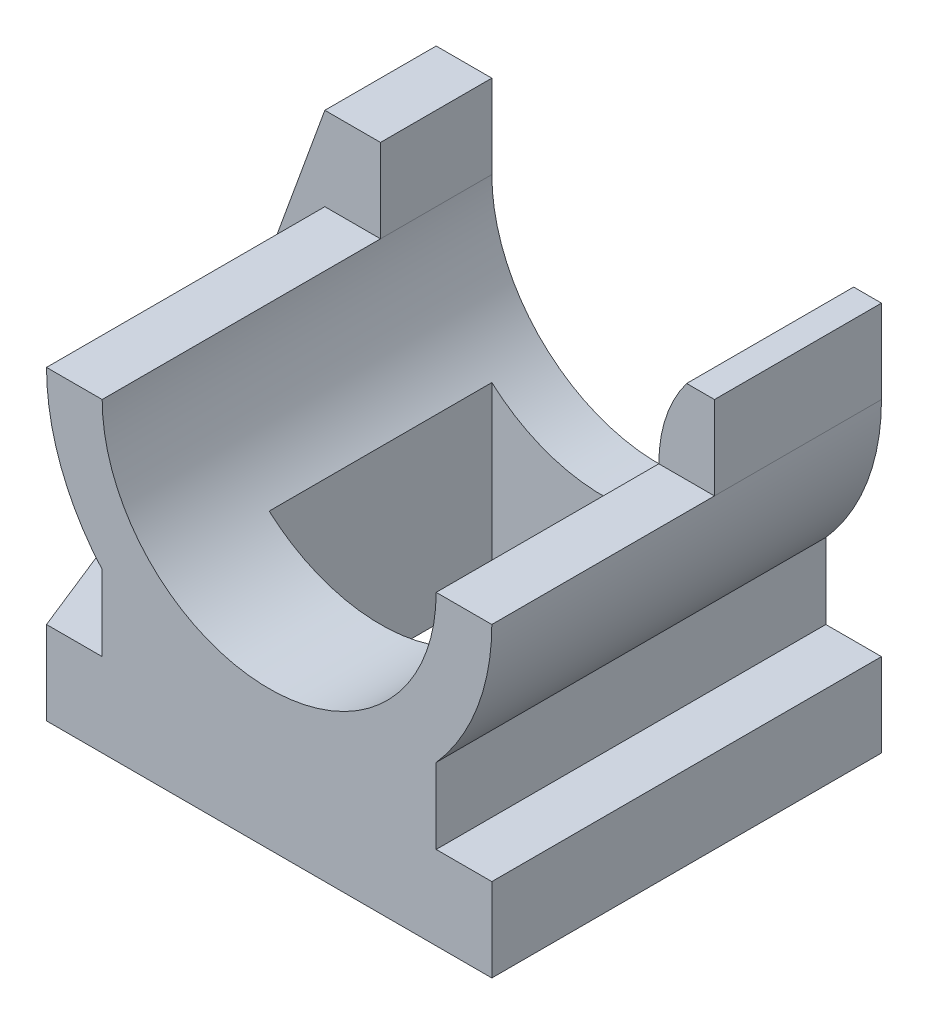
ISO-10303-21;
HEADER;
FILE_DESCRIPTION(('STEP AP214'),'2;1');
FILE_NAME('part.step','',(''),(''),'','','');
FILE_SCHEMA(('AUTOMOTIVE_DESIGN { 1 0 10303 214 1 1 1 1 }'));
ENDSEC;
DATA;
#1=APPLICATION_CONTEXT('core data for automotive mechanical design processes');
#2=APPLICATION_PROTOCOL_DEFINITION('international standard','automotive_design',2000,#1);
#3=PRODUCT_CONTEXT('',#1,'mechanical');
#4=PRODUCT('Part','Part','',(#3));
#5=PRODUCT_RELATED_PRODUCT_CATEGORY('part','',(#4));
#6=PRODUCT_DEFINITION_FORMATION('','',#4);
#7=PRODUCT_DEFINITION_CONTEXT('part definition',#1,'design');
#8=PRODUCT_DEFINITION('design','',#6,#7);
#9=PRODUCT_DEFINITION_SHAPE('','',#8);
#10=(LENGTH_UNIT() NAMED_UNIT(*) SI_UNIT(.MILLI.,.METRE.));
#11=(NAMED_UNIT(*) PLANE_ANGLE_UNIT() SI_UNIT($,.RADIAN.));
#12=(NAMED_UNIT(*) SI_UNIT($,.STERADIAN.) SOLID_ANGLE_UNIT());
#13=UNCERTAINTY_MEASURE_WITH_UNIT(LENGTH_MEASURE(1.E-05),#10,'distance_accuracy_value','');
#14=(GEOMETRIC_REPRESENTATION_CONTEXT(3) GLOBAL_UNCERTAINTY_ASSIGNED_CONTEXT((#13)) GLOBAL_UNIT_ASSIGNED_CONTEXT((#10,
#11,#12)) REPRESENTATION_CONTEXT('',''));
#15=CARTESIAN_POINT('',(0.,0.,0.));
#16=DIRECTION('',(0.,0.,1.));
#17=DIRECTION('',(1.,0.,0.));
#18=AXIS2_PLACEMENT_3D('',#15,#16,#17);
#19=CARTESIAN_POINT('',(0.,0.,0.));
#20=DIRECTION('',(0.,-1.,0.));
#21=DIRECTION('',(0.,0.,-1.));
#22=AXIS2_PLACEMENT_3D('',#19,#20,#21);
#23=PLANE('',#22);
#24=DIRECTION('',(0.,0.,1.));
#25=VECTOR('',#24,1.);
#26=CARTESIAN_POINT('',(-60.,0.,20.));
#27=LINE('',#26,#25);
#28=CARTESIAN_POINT('',(-60.,0.,0.));
#29=VERTEX_POINT('',#28);
#30=CARTESIAN_POINT('',(-60.,0.,20.));
#31=VERTEX_POINT('',#30);
#32=EDGE_CURVE('E309',#29,#31,#27,.T.);
#33=ORIENTED_EDGE('',*,*,#32,.F.);
#34=DIRECTION('',(-1.,0.,0.));
#35=VECTOR('',#34,1.);
#36=CARTESIAN_POINT('',(-60.,0.,0.));
#37=LINE('',#36,#35);
#38=CARTESIAN_POINT('',(40.,0.,0.));
#39=VERTEX_POINT('',#38);
#40=EDGE_CURVE('E312',#39,#29,#37,.T.);
#41=ORIENTED_EDGE('',*,*,#40,.F.);
#42=DIRECTION('',(0.,0.,-1.));
#43=VECTOR('',#42,1.);
#44=CARTESIAN_POINT('',(40.,0.,0.));
#45=LINE('',#44,#43);
#46=CARTESIAN_POINT('',(40.,0.,70.));
#47=VERTEX_POINT('',#46);
#48=EDGE_CURVE('E335',#47,#39,#45,.T.);
#49=ORIENTED_EDGE('',*,*,#48,.F.);
#50=DIRECTION('',(1.,0.,0.));
#51=VECTOR('',#50,1.);
#52=CARTESIAN_POINT('',(40.,0.,70.));
#53=LINE('',#52,#51);
#54=CARTESIAN_POINT('',(-40.,0.,70.));
#55=VERTEX_POINT('',#54);
#56=EDGE_CURVE('E329',#55,#47,#53,.T.);
#57=ORIENTED_EDGE('',*,*,#56,.F.);
#58=DIRECTION('',(0.371390676354104,0.,0.928476690885259));
#59=VECTOR('',#58,1.);
#60=CARTESIAN_POINT('',(-40.,0.,70.));
#61=LINE('',#60,#59);
#62=EDGE_CURVE('E327',#31,#55,#61,.T.);
#63=ORIENTED_EDGE('',*,*,#62,.F.);
#64=EDGE_LOOP('',(#33,#41,#49,#57,#63));
#65=FACE_BOUND('',#64,.T.);
#66=DIRECTION('',(-1.,0.,0.));
#67=VECTOR('',#66,1.);
#68=CARTESIAN_POINT('',(-20.,0.,10.));
#69=LINE('',#68,#67);
#70=CARTESIAN_POINT('',(20.,0.,10.));
#71=VERTEX_POINT('',#70);
#72=CARTESIAN_POINT('',(-20.,0.,10.));
#73=VERTEX_POINT('',#72);
#74=EDGE_CURVE('E215',#71,#73,#69,.T.);
#75=ORIENTED_EDGE('',*,*,#74,.T.);
#76=DIRECTION('',(0.,0.,1.));
#77=VECTOR('',#76,1.);
#78=CARTESIAN_POINT('',(-20.,0.,10.));
#79=LINE('',#78,#77);
#80=CARTESIAN_POINT('',(-20.,0.,50.));
#81=VERTEX_POINT('',#80);
#82=EDGE_CURVE('E59',#73,#81,#79,.T.);
#83=ORIENTED_EDGE('',*,*,#82,.T.);
#84=DIRECTION('',(1.,0.,0.));
#85=VECTOR('',#84,1.);
#86=CARTESIAN_POINT('',(-20.,0.,50.));
#87=LINE('',#86,#85);
#88=CARTESIAN_POINT('',(20.,0.,50.));
#89=VERTEX_POINT('',#88);
#90=EDGE_CURVE('E201',#81,#89,#87,.T.);
#91=ORIENTED_EDGE('',*,*,#90,.T.);
#92=DIRECTION('',(0.,0.,-1.));
#93=VECTOR('',#92,1.);
#94=CARTESIAN_POINT('',(20.,0.,10.));
#95=LINE('',#94,#93);
#96=EDGE_CURVE('E207',#89,#71,#95,.T.);
#97=ORIENTED_EDGE('',*,*,#96,.T.);
#98=EDGE_LOOP('',(#75,#83,#91,#97));
#99=FACE_BOUND('',#98,.T.);
#100=ADVANCED_FACE('F43',(#65,#99),#23,.T.);
#101=CARTESIAN_POINT('',(0.,55.,70.));
#102=DIRECTION('',(0.,0.,-1.));
#103=DIRECTION('',(-1.,0.,0.));
#104=AXIS2_PLACEMENT_3D('',#101,#102,#103);
#105=CYLINDRICAL_SURFACE('',#104,30.);
#106=CARTESIAN_POINT('',(0.,55.,0.));
#107=DIRECTION('',(0.,0.,1.));
#108=DIRECTION('',(1.,0.,0.));
#109=AXIS2_PLACEMENT_3D('',#106,#107,#108);
#110=CIRCLE('',#109,30.);
#111=CARTESIAN_POINT('',(-30.,55.,0.));
#112=VERTEX_POINT('',#111);
#113=CARTESIAN_POINT('',(30.,55.,0.));
#114=VERTEX_POINT('',#113);
#115=EDGE_CURVE('E200',#112,#114,#110,.T.);
#116=ORIENTED_EDGE('',*,*,#115,.F.);
#117=DIRECTION('',(0.,0.,-1.));
#118=VECTOR('',#117,1.);
#119=CARTESIAN_POINT('',(-30.,55.,70.));
#120=LINE('',#119,#118);
#121=CARTESIAN_POINT('',(-30.,55.,20.));
#122=VERTEX_POINT('',#121);
#123=EDGE_CURVE('E359',#122,#112,#120,.T.);
#124=ORIENTED_EDGE('',*,*,#123,.F.);
#125=DIRECTION('',(0.,0.,-1.));
#126=VECTOR('',#125,1.);
#127=CARTESIAN_POINT('',(-30.,55.,70.));
#128=LINE('',#127,#126);
#129=CARTESIAN_POINT('',(-30.,55.,70.));
#130=VERTEX_POINT('',#129);
#131=EDGE_CURVE('E224',#130,#122,#128,.T.);
#132=ORIENTED_EDGE('',*,*,#131,.F.);
#133=CARTESIAN_POINT('',(0.,55.,70.));
#134=DIRECTION('',(0.,0.,1.));
#135=DIRECTION('',(1.,0.,0.));
#136=AXIS2_PLACEMENT_3D('',#133,#134,#135);
#137=CIRCLE('',#136,30.);
#138=CARTESIAN_POINT('',(30.,55.,70.));
#139=VERTEX_POINT('',#138);
#140=EDGE_CURVE('E222',#130,#139,#137,.T.);
#141=ORIENTED_EDGE('',*,*,#140,.T.);
#142=DIRECTION('',(0.,0.,-1.));
#143=VECTOR('',#142,1.);
#144=CARTESIAN_POINT('',(30.,55.,70.));
#145=LINE('',#144,#143);
#146=CARTESIAN_POINT('',(30.,55.,30.));
#147=VERTEX_POINT('',#146);
#148=EDGE_CURVE('E227',#139,#147,#145,.T.);
#149=ORIENTED_EDGE('',*,*,#148,.T.);
#150=DIRECTION('',(0.,0.,-1.));
#151=VECTOR('',#150,1.);
#152=CARTESIAN_POINT('',(30.,55.,30.));
#153=LINE('',#152,#151);
#154=EDGE_CURVE('E255',#147,#114,#153,.T.);
#155=ORIENTED_EDGE('',*,*,#154,.T.);
#156=EDGE_LOOP('',(#116,#124,#132,#141,#149,#155));
#157=FACE_BOUND('',#156,.T.);
#158=CARTESIAN_POINT('',(0.,55.,50.));
#159=DIRECTION('',(0.,0.,-1.));
#160=DIRECTION('',(-1.,0.,0.));
#161=AXIS2_PLACEMENT_3D('',#158,#159,#160);
#162=CIRCLE('',#161,30.);
#163=CARTESIAN_POINT('',(20.,32.6393202250021,50.));
#164=VERTEX_POINT('',#163);
#165=CARTESIAN_POINT('',(-20.,32.6393202250021,50.));
#166=VERTEX_POINT('',#165);
#167=EDGE_CURVE('E51',#164,#166,#162,.T.);
#168=ORIENTED_EDGE('',*,*,#167,.T.);
#169=DIRECTION('',(0.,0.,-1.));
#170=VECTOR('',#169,1.);
#171=CARTESIAN_POINT('',(-20.,32.6393202250021,70.));
#172=LINE('',#171,#170);
#173=CARTESIAN_POINT('',(-20.,32.6393202250021,10.));
#174=VERTEX_POINT('',#173);
#175=EDGE_CURVE('E11',#166,#174,#172,.T.);
#176=ORIENTED_EDGE('',*,*,#175,.T.);
#177=CARTESIAN_POINT('',(0.,55.,10.));
#178=DIRECTION('',(0.,0.,1.));
#179=DIRECTION('',(1.,0.,0.));
#180=AXIS2_PLACEMENT_3D('',#177,#178,#179);
#181=CIRCLE('',#180,30.);
#182=CARTESIAN_POINT('',(20.,32.6393202250021,10.));
#183=VERTEX_POINT('',#182);
#184=EDGE_CURVE('E358',#174,#183,#181,.T.);
#185=ORIENTED_EDGE('',*,*,#184,.T.);
#186=DIRECTION('',(0.,0.,-1.));
#187=VECTOR('',#186,1.);
#188=CARTESIAN_POINT('',(20.,32.6393202250021,70.));
#189=LINE('',#188,#187);
#190=EDGE_CURVE('E361',#183,#164,#189,.F.);
#191=ORIENTED_EDGE('',*,*,#190,.T.);
#192=EDGE_LOOP('',(#168,#176,#185,#191));
#193=FACE_BOUND('',#192,.T.);
#194=ADVANCED_FACE('F368',(#157,#193),#105,.F.);
#195=CARTESIAN_POINT('',(40.,55.,70.));
#196=DIRECTION('',(0.,-1.,0.));
#197=DIRECTION('',(0.,0.,-1.));
#198=AXIS2_PLACEMENT_3D('',#195,#196,#197);
#199=PLANE('',#198);
#200=ORIENTED_EDGE('',*,*,#148,.F.);
#201=DIRECTION('',(-1.,0.,0.));
#202=VECTOR('',#201,1.);
#203=CARTESIAN_POINT('',(40.,55.,70.));
#204=LINE('',#203,#202);
#205=CARTESIAN_POINT('',(40.,55.,70.));
#206=VERTEX_POINT('',#205);
#207=EDGE_CURVE('E288',#206,#139,#204,.T.);
#208=ORIENTED_EDGE('',*,*,#207,.F.);
#209=DIRECTION('',(0.,0.,-1.));
#210=VECTOR('',#209,1.);
#211=CARTESIAN_POINT('',(40.,55.,70.));
#212=LINE('',#211,#210);
#213=CARTESIAN_POINT('',(40.,55.,30.));
#214=VERTEX_POINT('',#213);
#215=EDGE_CURVE('E301',#206,#214,#212,.T.);
#216=ORIENTED_EDGE('',*,*,#215,.T.);
#217=DIRECTION('',(1.,0.,0.));
#218=VECTOR('',#217,1.);
#219=CARTESIAN_POINT('',(30.,55.,30.));
#220=LINE('',#219,#218);
#221=EDGE_CURVE('E231',#147,#214,#220,.T.);
#222=ORIENTED_EDGE('',*,*,#221,.F.);
#223=EDGE_LOOP('',(#200,#208,#216,#222));
#224=FACE_BOUND('',#223,.T.);
#225=ADVANCED_FACE('F382',(#224),#199,.F.);
#226=CARTESIAN_POINT('',(-60.,15.,0.));
#227=DIRECTION('',(0.,0.,1.));
#228=DIRECTION('',(1.,0.,0.));
#229=AXIS2_PLACEMENT_3D('',#226,#227,#228);
#230=PLANE('',#229);
#231=DIRECTION('',(0.,1.,0.));
#232=VECTOR('',#231,1.);
#233=CARTESIAN_POINT('',(-30.,15.,0.));
#234=LINE('',#233,#232);
#235=CARTESIAN_POINT('',(-30.,70.,0.));
#236=VERTEX_POINT('',#235);
#237=EDGE_CURVE('E267',#112,#236,#234,.T.);
#238=ORIENTED_EDGE('',*,*,#237,.F.);
#239=ORIENTED_EDGE('',*,*,#115,.T.);
#240=CARTESIAN_POINT('',(55.,55.,0.));
#241=DIRECTION('',(0.,0.,1.));
#242=DIRECTION('',(1.,0.,0.));
#243=AXIS2_PLACEMENT_3D('',#240,#241,#242);
#244=CIRCLE('',#243,25.);
#245=CARTESIAN_POINT('',(35.,70.,0.));
#246=VERTEX_POINT('',#245);
#247=EDGE_CURVE('E229',#246,#114,#244,.T.);
#248=ORIENTED_EDGE('',*,*,#247,.F.);
#249=DIRECTION('',(-1.,0.,0.));
#250=VECTOR('',#249,1.);
#251=CARTESIAN_POINT('',(40.,70.,0.));
#252=LINE('',#251,#250);
#253=CARTESIAN_POINT('',(40.,70.,0.));
#254=VERTEX_POINT('',#253);
#255=EDGE_CURVE('E233',#254,#246,#252,.T.);
#256=ORIENTED_EDGE('',*,*,#255,.F.);
#257=DIRECTION('',(0.,1.,0.));
#258=VECTOR('',#257,1.);
#259=CARTESIAN_POINT('',(40.,55.,0.));
#260=LINE('',#259,#258);
#261=CARTESIAN_POINT('',(40.,55.,0.));
#262=VERTEX_POINT('',#261);
#263=EDGE_CURVE('E243',#262,#254,#260,.T.);
#264=ORIENTED_EDGE('',*,*,#263,.F.);
#265=CARTESIAN_POINT('',(0.,55.,0.));
#266=DIRECTION('',(0.,0.,1.));
#267=DIRECTION('',(1.,0.,0.));
#268=AXIS2_PLACEMENT_3D('',#265,#266,#267);
#269=CIRCLE('',#268,40.);
#270=CARTESIAN_POINT('',(30.,28.5424868893541,0.));
#271=VERTEX_POINT('',#270);
#272=EDGE_CURVE('E284',#271,#262,#269,.T.);
#273=ORIENTED_EDGE('',*,*,#272,.F.);
#274=DIRECTION('',(0.,1.,0.));
#275=VECTOR('',#274,1.);
#276=CARTESIAN_POINT('',(30.,10.,0.));
#277=LINE('',#276,#275);
#278=CARTESIAN_POINT('',(30.,15.,0.));
#279=VERTEX_POINT('',#278);
#280=EDGE_CURVE('E278',#279,#271,#277,.T.);
#281=ORIENTED_EDGE('',*,*,#280,.F.);
#282=DIRECTION('',(-1.,0.,0.));
#283=VECTOR('',#282,1.);
#284=CARTESIAN_POINT('',(-60.,15.,0.));
#285=LINE('',#284,#283);
#286=CARTESIAN_POINT('',(40.,15.,0.));
#287=VERTEX_POINT('',#286);
#288=EDGE_CURVE('E323',#287,#279,#285,.T.);
#289=ORIENTED_EDGE('',*,*,#288,.F.);
#290=DIRECTION('',(0.,-1.,0.));
#291=VECTOR('',#290,1.);
#292=CARTESIAN_POINT('',(40.,15.,0.));
#293=LINE('',#292,#291);
#294=EDGE_CURVE('E340',#287,#39,#293,.T.);
#295=ORIENTED_EDGE('',*,*,#294,.T.);
#296=ORIENTED_EDGE('',*,*,#40,.T.);
#297=DIRECTION('',(0.,-1.,0.));
#298=VECTOR('',#297,1.);
#299=CARTESIAN_POINT('',(-60.,15.,0.));
#300=LINE('',#299,#298);
#301=CARTESIAN_POINT('',(-60.,15.,0.));
#302=VERTEX_POINT('',#301);
#303=EDGE_CURVE('E324',#302,#29,#300,.T.);
#304=ORIENTED_EDGE('',*,*,#303,.F.);
#305=DIRECTION('',(-0.341743063086704,-0.939793423488437,0.));
#306=VECTOR('',#305,1.);
#307=CARTESIAN_POINT('',(-40.,70.,0.));
#308=LINE('',#307,#306);
#309=CARTESIAN_POINT('',(-40.,70.,0.));
#310=VERTEX_POINT('',#309);
#311=EDGE_CURVE('E258',#310,#302,#308,.T.);
#312=ORIENTED_EDGE('',*,*,#311,.F.);
#313=DIRECTION('',(-1.,0.,0.));
#314=VECTOR('',#313,1.);
#315=CARTESIAN_POINT('',(-30.,70.,0.));
#316=LINE('',#315,#314);
#317=EDGE_CURVE('E257',#236,#310,#316,.T.);
#318=ORIENTED_EDGE('',*,*,#317,.F.);
#319=EDGE_LOOP('',(#238,#239,#248,#256,#264,#273,#281,#289,#295,#296,#304,#312,#318));
#320=FACE_BOUND('',#319,.T.);
#321=ADVANCED_FACE('F391',(#320),#230,.F.);
#322=CARTESIAN_POINT('',(-40.,55.,70.));
#323=VERTEX_POINT('',#322);
#324=EDGE_CURVE('E286',#130,#323,#204,.T.);
#325=ORIENTED_EDGE('',*,*,#324,.F.);
#326=ORIENTED_EDGE('',*,*,#131,.T.);
#327=DIRECTION('',(-1.,0.,0.));
#328=VECTOR('',#327,1.);
#329=CARTESIAN_POINT('',(40.,55.,20.));
#330=LINE('',#329,#328);
#331=CARTESIAN_POINT('',(-40.,55.,20.));
#332=VERTEX_POINT('',#331);
#333=EDGE_CURVE('E280',#122,#332,#330,.T.);
#334=ORIENTED_EDGE('',*,*,#333,.T.);
#335=DIRECTION('',(0.,0.,-1.));
#336=VECTOR('',#335,1.);
#337=CARTESIAN_POINT('',(-40.,55.,70.));
#338=LINE('',#337,#336);
#339=EDGE_CURVE('E302',#323,#332,#338,.T.);
#340=ORIENTED_EDGE('',*,*,#339,.F.);
#341=EDGE_LOOP('',(#325,#326,#334,#340));
#342=FACE_BOUND('',#341,.T.);
#343=ADVANCED_FACE('F393',(#342),#199,.F.);
#344=CARTESIAN_POINT('',(0.,15.,0.));
#345=DIRECTION('',(0.,-1.,0.));
#346=DIRECTION('',(0.,0.,-1.));
#347=AXIS2_PLACEMENT_3D('',#344,#345,#346);
#348=PLANE('',#347);
#349=DIRECTION('',(1.,0.,0.));
#350=VECTOR('',#349,1.);
#351=CARTESIAN_POINT('',(-60.,15.,20.));
#352=LINE('',#351,#350);
#353=CARTESIAN_POINT('',(-60.,15.,20.));
#354=VERTEX_POINT('',#353);
#355=CARTESIAN_POINT('',(-30.,15.,20.));
#356=VERTEX_POINT('',#355);
#357=EDGE_CURVE('E259',#354,#356,#352,.T.);
#358=ORIENTED_EDGE('',*,*,#357,.F.);
#359=DIRECTION('',(0.371390676354104,0.,0.928476690885259));
#360=VECTOR('',#359,1.);
#361=CARTESIAN_POINT('',(-40.,15.,70.));
#362=LINE('',#361,#360);
#363=CARTESIAN_POINT('',(-40.,15.,70.));
#364=VERTEX_POINT('',#363);
#365=EDGE_CURVE('E314',#354,#364,#362,.T.);
#366=ORIENTED_EDGE('',*,*,#365,.T.);
#367=DIRECTION('',(1.,0.,0.));
#368=VECTOR('',#367,1.);
#369=CARTESIAN_POINT('',(40.,15.,70.));
#370=LINE('',#369,#368);
#371=CARTESIAN_POINT('',(-30.,15.,70.));
#372=VERTEX_POINT('',#371);
#373=EDGE_CURVE('E318',#364,#372,#370,.T.);
#374=ORIENTED_EDGE('',*,*,#373,.T.);
#375=DIRECTION('',(0.,0.,1.));
#376=VECTOR('',#375,1.);
#377=CARTESIAN_POINT('',(-30.,15.,0.));
#378=LINE('',#377,#376);
#379=EDGE_CURVE('E355',#356,#372,#378,.T.);
#380=ORIENTED_EDGE('',*,*,#379,.F.);
#381=EDGE_LOOP('',(#358,#366,#374,#380));
#382=FACE_BOUND('',#381,.T.);
#383=ADVANCED_FACE('F386',(#382),#348,.F.);
#384=CARTESIAN_POINT('',(-30.,28.5424868893541,70.));
#385=DIRECTION('',(1.,0.,0.));
#386=DIRECTION('',(0.,0.,-1.));
#387=AXIS2_PLACEMENT_3D('',#384,#385,#386);
#388=PLANE('',#387);
#389=DIRECTION('',(0.,1.,0.));
#390=VECTOR('',#389,1.);
#391=CARTESIAN_POINT('',(-30.,15.,20.));
#392=LINE('',#391,#390);
#393=CARTESIAN_POINT('',(-30.,28.5424868893541,20.));
#394=VERTEX_POINT('',#393);
#395=EDGE_CURVE('E263',#356,#394,#392,.T.);
#396=ORIENTED_EDGE('',*,*,#395,.F.);
#397=ORIENTED_EDGE('',*,*,#379,.T.);
#398=DIRECTION('',(0.,-1.,0.));
#399=VECTOR('',#398,1.);
#400=CARTESIAN_POINT('',(-30.,28.5424868893541,70.));
#401=LINE('',#400,#399);
#402=CARTESIAN_POINT('',(-30.,28.5424868893541,70.));
#403=VERTEX_POINT('',#402);
#404=EDGE_CURVE('E281',#403,#372,#401,.T.);
#405=ORIENTED_EDGE('',*,*,#404,.F.);
#406=DIRECTION('',(0.,0.,-1.));
#407=VECTOR('',#406,1.);
#408=CARTESIAN_POINT('',(-30.,28.5424868893541,70.));
#409=LINE('',#408,#407);
#410=EDGE_CURVE('E293',#403,#394,#409,.T.);
#411=ORIENTED_EDGE('',*,*,#410,.T.);
#412=EDGE_LOOP('',(#396,#397,#405,#411));
#413=FACE_BOUND('',#412,.T.);
#414=ADVANCED_FACE('F474',(#413),#388,.F.);
#415=DIRECTION('',(0.,0.,-1.));
#416=VECTOR('',#415,1.);
#417=CARTESIAN_POINT('',(30.,15.,0.));
#418=LINE('',#417,#416);
#419=CARTESIAN_POINT('',(30.,15.,70.));
#420=VERTEX_POINT('',#419);
#421=EDGE_CURVE('E349',#420,#279,#418,.T.);
#422=ORIENTED_EDGE('',*,*,#421,.F.);
#423=CARTESIAN_POINT('',(40.,15.,70.));
#424=VERTEX_POINT('',#423);
#425=EDGE_CURVE('E320',#420,#424,#370,.T.);
#426=ORIENTED_EDGE('',*,*,#425,.T.);
#427=DIRECTION('',(0.,0.,-1.));
#428=VECTOR('',#427,1.);
#429=CARTESIAN_POINT('',(40.,15.,0.));
#430=LINE('',#429,#428);
#431=EDGE_CURVE('E321',#424,#287,#430,.T.);
#432=ORIENTED_EDGE('',*,*,#431,.T.);
#433=ORIENTED_EDGE('',*,*,#288,.T.);
#434=EDGE_LOOP('',(#422,#426,#432,#433));
#435=FACE_BOUND('',#434,.T.);
#436=ADVANCED_FACE('F412',(#435),#348,.F.);
#437=CARTESIAN_POINT('',(-60.,15.,20.));
#438=DIRECTION('',(1.,0.,0.));
#439=DIRECTION('',(0.,0.,-1.));
#440=AXIS2_PLACEMENT_3D('',#437,#438,#439);
#441=PLANE('',#440);
#442=ORIENTED_EDGE('',*,*,#32,.T.);
#443=DIRECTION('',(0.,-1.,0.));
#444=VECTOR('',#443,1.);
#445=CARTESIAN_POINT('',(-60.,15.,20.));
#446=LINE('',#445,#444);
#447=EDGE_CURVE('E347',#354,#31,#446,.T.);
#448=ORIENTED_EDGE('',*,*,#447,.F.);
#449=DIRECTION('',(0.,0.,1.));
#450=VECTOR('',#449,1.);
#451=CARTESIAN_POINT('',(-60.,15.,20.));
#452=LINE('',#451,#450);
#453=EDGE_CURVE('E313',#302,#354,#452,.T.);
#454=ORIENTED_EDGE('',*,*,#453,.F.);
#455=ORIENTED_EDGE('',*,*,#303,.T.);
#456=EDGE_LOOP('',(#442,#448,#454,#455));
#457=FACE_BOUND('',#456,.T.);
#458=ADVANCED_FACE('F44',(#457),#441,.F.);
#459=CARTESIAN_POINT('',(-40.,15.,70.));
#460=DIRECTION('',(0.928476690885259,0.,-0.371390676354104));
#461=DIRECTION('',(-0.371390676354104,0.,-0.92847669088526));
#462=AXIS2_PLACEMENT_3D('',#459,#460,#461);
#463=PLANE('',#462);
#464=ORIENTED_EDGE('',*,*,#62,.T.);
#465=DIRECTION('',(0.,-1.,0.));
#466=VECTOR('',#465,1.);
#467=CARTESIAN_POINT('',(-40.,15.,70.));
#468=LINE('',#467,#466);
#469=EDGE_CURVE('E345',#364,#55,#468,.T.);
#470=ORIENTED_EDGE('',*,*,#469,.F.);
#471=ORIENTED_EDGE('',*,*,#365,.F.);
#472=ORIENTED_EDGE('',*,*,#447,.T.);
#473=EDGE_LOOP('',(#464,#470,#471,#472));
#474=FACE_BOUND('',#473,.T.);
#475=ADVANCED_FACE('F401',(#474),#463,.F.);
#476=CARTESIAN_POINT('',(40.,15.,70.));
#477=DIRECTION('',(0.,0.,-1.));
#478=DIRECTION('',(-1.,0.,0.));
#479=AXIS2_PLACEMENT_3D('',#476,#477,#478);
#480=PLANE('',#479);
#481=ORIENTED_EDGE('',*,*,#140,.F.);
#482=ORIENTED_EDGE('',*,*,#324,.T.);
#483=CARTESIAN_POINT('',(0.,55.,70.));
#484=DIRECTION('',(0.,0.,1.));
#485=DIRECTION('',(1.,0.,0.));
#486=AXIS2_PLACEMENT_3D('',#483,#484,#485);
#487=CIRCLE('',#486,40.);
#488=EDGE_CURVE('E291',#323,#403,#487,.T.);
#489=ORIENTED_EDGE('',*,*,#488,.T.);
#490=ORIENTED_EDGE('',*,*,#404,.T.);
#491=ORIENTED_EDGE('',*,*,#373,.F.);
#492=ORIENTED_EDGE('',*,*,#469,.T.);
#493=ORIENTED_EDGE('',*,*,#56,.T.);
#494=DIRECTION('',(0.,-1.,0.));
#495=VECTOR('',#494,1.);
#496=CARTESIAN_POINT('',(40.,15.,70.));
#497=LINE('',#496,#495);
#498=EDGE_CURVE('E339',#424,#47,#497,.T.);
#499=ORIENTED_EDGE('',*,*,#498,.F.);
#500=ORIENTED_EDGE('',*,*,#425,.F.);
#501=DIRECTION('',(0.,1.,0.));
#502=VECTOR('',#501,1.);
#503=CARTESIAN_POINT('',(30.,10.,70.));
#504=LINE('',#503,#502);
#505=CARTESIAN_POINT('',(30.,28.5424868893541,70.));
#506=VERTEX_POINT('',#505);
#507=EDGE_CURVE('E283',#420,#506,#504,.T.);
#508=ORIENTED_EDGE('',*,*,#507,.T.);
#509=CARTESIAN_POINT('',(0.,55.,70.));
#510=DIRECTION('',(0.,0.,1.));
#511=DIRECTION('',(1.,0.,0.));
#512=AXIS2_PLACEMENT_3D('',#509,#510,#511);
#513=CIRCLE('',#512,40.);
#514=EDGE_CURVE('E289',#506,#206,#513,.T.);
#515=ORIENTED_EDGE('',*,*,#514,.T.);
#516=ORIENTED_EDGE('',*,*,#207,.T.);
#517=EDGE_LOOP('',(#481,#482,#489,#490,#491,#492,#493,#499,#500,#508,#515,#516));
#518=FACE_BOUND('',#517,.T.);
#519=ADVANCED_FACE('F398',(#518),#480,.F.);
#520=CARTESIAN_POINT('',(40.,15.,0.));
#521=DIRECTION('',(-1.,0.,0.));
#522=DIRECTION('',(0.,0.,1.));
#523=AXIS2_PLACEMENT_3D('',#520,#521,#522);
#524=PLANE('',#523);
#525=ORIENTED_EDGE('',*,*,#48,.T.);
#526=ORIENTED_EDGE('',*,*,#294,.F.);
#527=ORIENTED_EDGE('',*,*,#431,.F.);
#528=ORIENTED_EDGE('',*,*,#498,.T.);
#529=EDGE_LOOP('',(#525,#526,#527,#528));
#530=FACE_BOUND('',#529,.T.);
#531=ADVANCED_FACE('F397',(#530),#524,.F.);
#532=CARTESIAN_POINT('',(30.,10.,70.));
#533=DIRECTION('',(-1.,0.,0.));
#534=DIRECTION('',(0.,0.,1.));
#535=AXIS2_PLACEMENT_3D('',#532,#533,#534);
#536=PLANE('',#535);
#537=ORIENTED_EDGE('',*,*,#507,.F.);
#538=ORIENTED_EDGE('',*,*,#421,.T.);
#539=ORIENTED_EDGE('',*,*,#280,.T.);
#540=DIRECTION('',(0.,0.,-1.));
#541=VECTOR('',#540,1.);
#542=CARTESIAN_POINT('',(30.,28.5424868893541,70.));
#543=LINE('',#542,#541);
#544=EDGE_CURVE('E307',#506,#271,#543,.T.);
#545=ORIENTED_EDGE('',*,*,#544,.F.);
#546=EDGE_LOOP('',(#537,#538,#539,#545));
#547=FACE_BOUND('',#546,.T.);
#548=ADVANCED_FACE('F396',(#547),#536,.F.);
#549=CARTESIAN_POINT('',(0.,55.,70.));
#550=DIRECTION('',(0.,0.,-1.));
#551=DIRECTION('',(-1.,0.,0.));
#552=AXIS2_PLACEMENT_3D('',#549,#550,#551);
#553=CYLINDRICAL_SURFACE('',#552,40.);
#554=ORIENTED_EDGE('',*,*,#272,.T.);
#555=DIRECTION('',(0.,0.,-1.));
#556=VECTOR('',#555,1.);
#557=CARTESIAN_POINT('',(40.,55.,30.));
#558=LINE('',#557,#556);
#559=EDGE_CURVE('E252',#214,#262,#558,.T.);
#560=ORIENTED_EDGE('',*,*,#559,.F.);
#561=ORIENTED_EDGE('',*,*,#215,.F.);
#562=ORIENTED_EDGE('',*,*,#514,.F.);
#563=ORIENTED_EDGE('',*,*,#544,.T.);
#564=EDGE_LOOP('',(#554,#560,#561,#562,#563));
#565=FACE_BOUND('',#564,.T.);
#566=ADVANCED_FACE('F438',(#565),#553,.T.);
#567=CARTESIAN_POINT('',(0.,55.,70.));
#568=DIRECTION('',(0.,0.,-1.));
#569=DIRECTION('',(-1.,0.,0.));
#570=AXIS2_PLACEMENT_3D('',#567,#568,#569);
#571=CYLINDRICAL_SURFACE('',#570,40.);
#572=ORIENTED_EDGE('',*,*,#339,.T.);
#573=CARTESIAN_POINT('',(0.,55.,20.));
#574=DIRECTION('',(0.,0.,1.));
#575=DIRECTION('',(1.,0.,0.));
#576=AXIS2_PLACEMENT_3D('',#573,#574,#575);
#577=CIRCLE('',#576,40.);
#578=EDGE_CURVE('E353',#332,#394,#577,.T.);
#579=ORIENTED_EDGE('',*,*,#578,.T.);
#580=ORIENTED_EDGE('',*,*,#410,.F.);
#581=ORIENTED_EDGE('',*,*,#488,.F.);
#582=EDGE_LOOP('',(#572,#579,#580,#581));
#583=FACE_BOUND('',#582,.T.);
#584=ADVANCED_FACE('F468',(#583),#571,.T.);
#585=CARTESIAN_POINT('',(-30.,15.,20.));
#586=DIRECTION('',(-1.,0.,0.));
#587=DIRECTION('',(0.,0.,1.));
#588=AXIS2_PLACEMENT_3D('',#585,#586,#587);
#589=PLANE('',#588);
#590=CARTESIAN_POINT('',(-30.,70.,20.));
#591=VERTEX_POINT('',#590);
#592=EDGE_CURVE('E265',#122,#591,#392,.T.);
#593=ORIENTED_EDGE('',*,*,#592,.F.);
#594=ORIENTED_EDGE('',*,*,#123,.T.);
#595=ORIENTED_EDGE('',*,*,#237,.T.);
#596=DIRECTION('',(0.,0.,-1.));
#597=VECTOR('',#596,1.);
#598=CARTESIAN_POINT('',(-30.,70.,20.));
#599=LINE('',#598,#597);
#600=EDGE_CURVE('E273',#591,#236,#599,.T.);
#601=ORIENTED_EDGE('',*,*,#600,.F.);
#602=EDGE_LOOP('',(#593,#594,#595,#601));
#603=FACE_BOUND('',#602,.T.);
#604=ADVANCED_FACE('F456',(#603),#589,.F.);
#605=CARTESIAN_POINT('',(-40.,70.,20.));
#606=DIRECTION('',(0.939793423488437,-0.341743063086704,0.));
#607=DIRECTION('',(0.341743063086704,0.939793423488437,0.));
#608=AXIS2_PLACEMENT_3D('',#605,#606,#607);
#609=PLANE('',#608);
#610=ORIENTED_EDGE('',*,*,#311,.T.);
#611=ORIENTED_EDGE('',*,*,#453,.T.);
#612=DIRECTION('',(-0.341743063086704,-0.939793423488437,0.));
#613=VECTOR('',#612,1.);
#614=CARTESIAN_POINT('',(-40.,70.,20.));
#615=LINE('',#614,#613);
#616=CARTESIAN_POINT('',(-40.,70.,20.));
#617=VERTEX_POINT('',#616);
#618=EDGE_CURVE('E260',#617,#354,#615,.T.);
#619=ORIENTED_EDGE('',*,*,#618,.F.);
#620=DIRECTION('',(0.,0.,-1.));
#621=VECTOR('',#620,1.);
#622=CARTESIAN_POINT('',(-40.,70.,20.));
#623=LINE('',#622,#621);
#624=EDGE_CURVE('E270',#617,#310,#623,.T.);
#625=ORIENTED_EDGE('',*,*,#624,.T.);
#626=EDGE_LOOP('',(#610,#611,#619,#625));
#627=FACE_BOUND('',#626,.T.);
#628=ADVANCED_FACE('F485',(#627),#609,.F.);
#629=CARTESIAN_POINT('',(-30.,70.,20.));
#630=DIRECTION('',(0.,-1.,0.));
#631=DIRECTION('',(0.,0.,-1.));
#632=AXIS2_PLACEMENT_3D('',#629,#630,#631);
#633=PLANE('',#632);
#634=ORIENTED_EDGE('',*,*,#317,.T.);
#635=ORIENTED_EDGE('',*,*,#624,.F.);
#636=DIRECTION('',(-1.,0.,0.));
#637=VECTOR('',#636,1.);
#638=CARTESIAN_POINT('',(-30.,70.,20.));
#639=LINE('',#638,#637);
#640=EDGE_CURVE('E264',#591,#617,#639,.T.);
#641=ORIENTED_EDGE('',*,*,#640,.F.);
#642=ORIENTED_EDGE('',*,*,#600,.T.);
#643=EDGE_LOOP('',(#634,#635,#641,#642));
#644=FACE_BOUND('',#643,.T.);
#645=ADVANCED_FACE('F484',(#644),#633,.F.);
#646=CARTESIAN_POINT('',(0.,0.,20.));
#647=DIRECTION('',(0.,0.,1.));
#648=DIRECTION('',(1.,0.,0.));
#649=AXIS2_PLACEMENT_3D('',#646,#647,#648);
#650=PLANE('',#649);
#651=ORIENTED_EDGE('',*,*,#333,.F.);
#652=ORIENTED_EDGE('',*,*,#592,.T.);
#653=ORIENTED_EDGE('',*,*,#640,.T.);
#654=ORIENTED_EDGE('',*,*,#618,.T.);
#655=ORIENTED_EDGE('',*,*,#357,.T.);
#656=ORIENTED_EDGE('',*,*,#395,.T.);
#657=ORIENTED_EDGE('',*,*,#578,.F.);
#658=EDGE_LOOP('',(#651,#652,#653,#654,#655,#656,#657));
#659=FACE_BOUND('',#658,.T.);
#660=ADVANCED_FACE('F462',(#659),#650,.T.);
#661=CARTESIAN_POINT('',(55.,55.,30.));
#662=DIRECTION('',(0.,0.,-1.));
#663=DIRECTION('',(-1.,0.,0.));
#664=AXIS2_PLACEMENT_3D('',#661,#662,#663);
#665=CYLINDRICAL_SURFACE('',#664,25.);
#666=ORIENTED_EDGE('',*,*,#247,.T.);
#667=ORIENTED_EDGE('',*,*,#154,.F.);
#668=CARTESIAN_POINT('',(55.,55.,30.));
#669=DIRECTION('',(0.,0.,1.));
#670=DIRECTION('',(1.,0.,0.));
#671=AXIS2_PLACEMENT_3D('',#668,#669,#670);
#672=CIRCLE('',#671,25.);
#673=CARTESIAN_POINT('',(35.,70.,30.));
#674=VERTEX_POINT('',#673);
#675=EDGE_CURVE('E232',#674,#147,#672,.T.);
#676=ORIENTED_EDGE('',*,*,#675,.F.);
#677=DIRECTION('',(0.,0.,-1.));
#678=VECTOR('',#677,1.);
#679=CARTESIAN_POINT('',(35.,70.,30.));
#680=LINE('',#679,#678);
#681=EDGE_CURVE('E241',#674,#246,#680,.T.);
#682=ORIENTED_EDGE('',*,*,#681,.T.);
#683=EDGE_LOOP('',(#666,#667,#676,#682));
#684=FACE_BOUND('',#683,.T.);
#685=ADVANCED_FACE('F452',(#684),#665,.T.);
#686=CARTESIAN_POINT('',(40.,55.,30.));
#687=DIRECTION('',(-1.,0.,0.));
#688=DIRECTION('',(0.,0.,1.));
#689=AXIS2_PLACEMENT_3D('',#686,#687,#688);
#690=PLANE('',#689);
#691=ORIENTED_EDGE('',*,*,#263,.T.);
#692=DIRECTION('',(0.,0.,-1.));
#693=VECTOR('',#692,1.);
#694=CARTESIAN_POINT('',(40.,70.,30.));
#695=LINE('',#694,#693);
#696=CARTESIAN_POINT('',(40.,70.,30.));
#697=VERTEX_POINT('',#696);
#698=EDGE_CURVE('E246',#697,#254,#695,.T.);
#699=ORIENTED_EDGE('',*,*,#698,.F.);
#700=DIRECTION('',(0.,1.,0.));
#701=VECTOR('',#700,1.);
#702=CARTESIAN_POINT('',(40.,55.,30.));
#703=LINE('',#702,#701);
#704=EDGE_CURVE('E240',#214,#697,#703,.T.);
#705=ORIENTED_EDGE('',*,*,#704,.F.);
#706=ORIENTED_EDGE('',*,*,#559,.T.);
#707=EDGE_LOOP('',(#691,#699,#705,#706));
#708=FACE_BOUND('',#707,.T.);
#709=ADVANCED_FACE('F560',(#708),#690,.F.);
#710=CARTESIAN_POINT('',(40.,70.,30.));
#711=DIRECTION('',(0.,-1.,0.));
#712=DIRECTION('',(0.,0.,-1.));
#713=AXIS2_PLACEMENT_3D('',#710,#711,#712);
#714=PLANE('',#713);
#715=ORIENTED_EDGE('',*,*,#255,.T.);
#716=ORIENTED_EDGE('',*,*,#681,.F.);
#717=DIRECTION('',(-1.,0.,0.));
#718=VECTOR('',#717,1.);
#719=CARTESIAN_POINT('',(40.,70.,30.));
#720=LINE('',#719,#718);
#721=EDGE_CURVE('E239',#697,#674,#720,.T.);
#722=ORIENTED_EDGE('',*,*,#721,.F.);
#723=ORIENTED_EDGE('',*,*,#698,.T.);
#724=EDGE_LOOP('',(#715,#716,#722,#723));
#725=FACE_BOUND('',#724,.T.);
#726=ADVANCED_FACE('F561',(#725),#714,.F.);
#727=CARTESIAN_POINT('',(55.,55.,30.));
#728=DIRECTION('',(0.,0.,1.));
#729=DIRECTION('',(1.,0.,0.));
#730=AXIS2_PLACEMENT_3D('',#727,#728,#729);
#731=PLANE('',#730);
#732=ORIENTED_EDGE('',*,*,#675,.T.);
#733=ORIENTED_EDGE('',*,*,#221,.T.);
#734=ORIENTED_EDGE('',*,*,#704,.T.);
#735=ORIENTED_EDGE('',*,*,#721,.T.);
#736=EDGE_LOOP('',(#732,#733,#734,#735));
#737=FACE_BOUND('',#736,.T.);
#738=ADVANCED_FACE('F446',(#737),#731,.T.);
#739=CARTESIAN_POINT('',(-20.,70.,10.));
#740=DIRECTION('',(1.,0.,0.));
#741=DIRECTION('',(0.,0.,-1.));
#742=AXIS2_PLACEMENT_3D('',#739,#740,#741);
#743=PLANE('',#742);
#744=DIRECTION('',(0.,-1.,0.));
#745=VECTOR('',#744,1.);
#746=CARTESIAN_POINT('',(-20.,70.,50.));
#747=LINE('',#746,#745);
#748=EDGE_CURVE('E191',#166,#81,#747,.T.);
#749=ORIENTED_EDGE('',*,*,#748,.T.);
#750=ORIENTED_EDGE('',*,*,#82,.F.);
#751=DIRECTION('',(0.,-1.,0.));
#752=VECTOR('',#751,1.);
#753=CARTESIAN_POINT('',(-20.,70.,10.));
#754=LINE('',#753,#752);
#755=EDGE_CURVE('E220',#174,#73,#754,.T.);
#756=ORIENTED_EDGE('',*,*,#755,.F.);
#757=ORIENTED_EDGE('',*,*,#175,.F.);
#758=EDGE_LOOP('',(#749,#750,#756,#757));
#759=FACE_BOUND('',#758,.T.);
#760=ADVANCED_FACE('F198',(#759),#743,.T.);
#761=CARTESIAN_POINT('',(-20.,70.,50.));
#762=DIRECTION('',(0.,0.,-1.));
#763=DIRECTION('',(-1.,0.,0.));
#764=AXIS2_PLACEMENT_3D('',#761,#762,#763);
#765=PLANE('',#764);
#766=DIRECTION('',(0.,-1.,0.));
#767=VECTOR('',#766,1.);
#768=CARTESIAN_POINT('',(20.,70.,50.));
#769=LINE('',#768,#767);
#770=EDGE_CURVE('E199',#164,#89,#769,.T.);
#771=ORIENTED_EDGE('',*,*,#770,.T.);
#772=ORIENTED_EDGE('',*,*,#90,.F.);
#773=ORIENTED_EDGE('',*,*,#748,.F.);
#774=ORIENTED_EDGE('',*,*,#167,.F.);
#775=EDGE_LOOP('',(#771,#772,#773,#774));
#776=FACE_BOUND('',#775,.T.);
#777=ADVANCED_FACE('F204',(#776),#765,.T.);
#778=CARTESIAN_POINT('',(20.,70.,10.));
#779=DIRECTION('',(-1.,0.,0.));
#780=DIRECTION('',(0.,0.,1.));
#781=AXIS2_PLACEMENT_3D('',#778,#779,#780);
#782=PLANE('',#781);
#783=DIRECTION('',(0.,-1.,0.));
#784=VECTOR('',#783,1.);
#785=CARTESIAN_POINT('',(20.,70.,10.));
#786=LINE('',#785,#784);
#787=EDGE_CURVE('E67',#183,#71,#786,.T.);
#788=ORIENTED_EDGE('',*,*,#787,.T.);
#789=ORIENTED_EDGE('',*,*,#96,.F.);
#790=ORIENTED_EDGE('',*,*,#770,.F.);
#791=ORIENTED_EDGE('',*,*,#190,.F.);
#792=EDGE_LOOP('',(#788,#789,#790,#791));
#793=FACE_BOUND('',#792,.T.);
#794=ADVANCED_FACE('F366',(#793),#782,.T.);
#795=CARTESIAN_POINT('',(-20.,70.,10.));
#796=DIRECTION('',(0.,0.,1.));
#797=DIRECTION('',(1.,0.,0.));
#798=AXIS2_PLACEMENT_3D('',#795,#796,#797);
#799=PLANE('',#798);
#800=ORIENTED_EDGE('',*,*,#755,.T.);
#801=ORIENTED_EDGE('',*,*,#74,.F.);
#802=ORIENTED_EDGE('',*,*,#787,.F.);
#803=ORIENTED_EDGE('',*,*,#184,.F.);
#804=EDGE_LOOP('',(#800,#801,#802,#803));
#805=FACE_BOUND('',#804,.T.);
#806=ADVANCED_FACE('F369',(#805),#799,.T.);
#807=CLOSED_SHELL('',(#100,#194,#225,#321,#343,#383,#414,#436,#458,#475,#519,#531,#548,#566,
#584,#604,#628,#645,#660,#685,#709,#726,#738,#760,#777,#794,#806));
#808=MANIFOLD_SOLID_BREP('B2',#807);
#809=ADVANCED_BREP_SHAPE_REPRESENTATION('',(#18,#808),#14);
#810=SHAPE_DEFINITION_REPRESENTATION(#9,#809);
ENDSEC;
END-ISO-10303-21;
